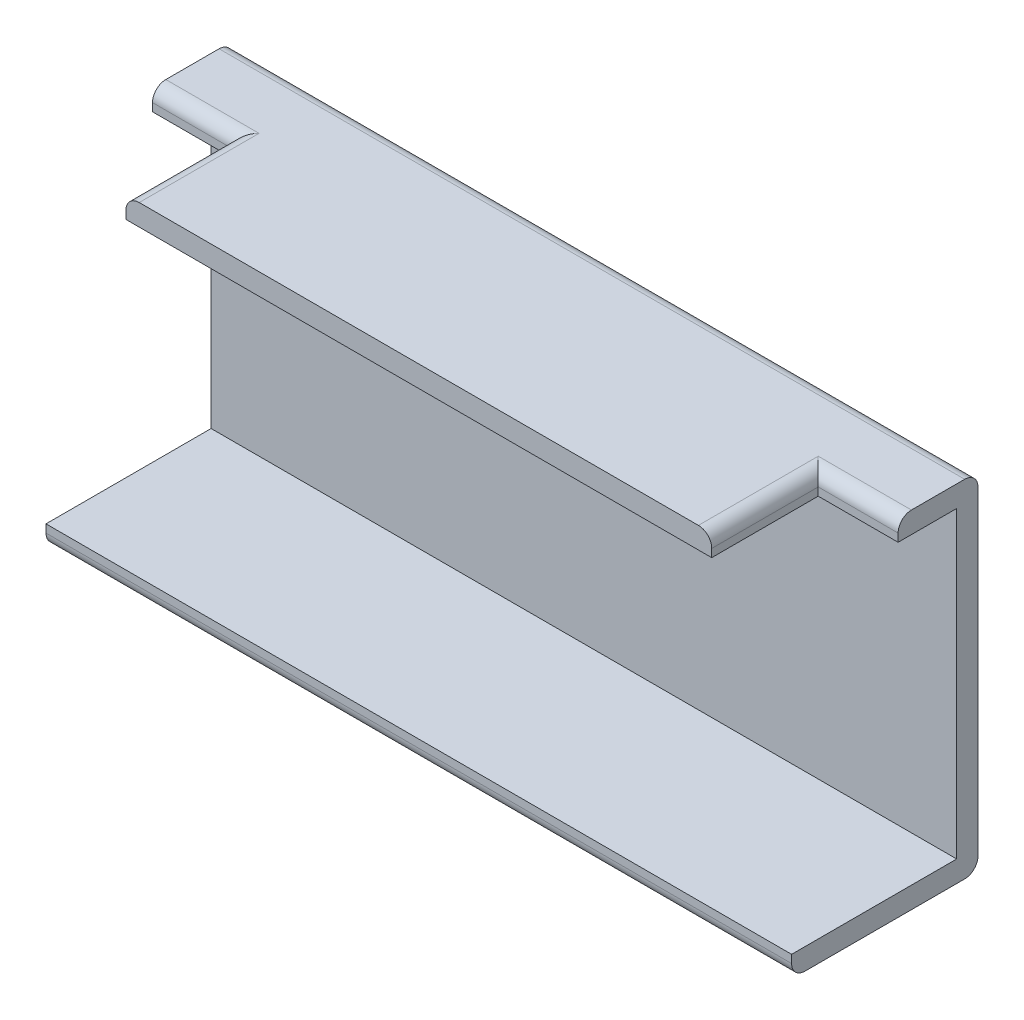
ISO-10303-21;
HEADER;
FILE_DESCRIPTION(('STEP AP214'),'2;1');
FILE_NAME('part.step','',(''),(''),'','','');
FILE_SCHEMA(('AUTOMOTIVE_DESIGN { 1 0 10303 214 1 1 1 1 }'));
ENDSEC;
DATA;
#1=APPLICATION_CONTEXT('core data for automotive mechanical design processes');
#2=APPLICATION_PROTOCOL_DEFINITION('international standard','automotive_design',2000,#1);
#3=PRODUCT_CONTEXT('',#1,'mechanical');
#4=PRODUCT('Part','Part','',(#3));
#5=PRODUCT_RELATED_PRODUCT_CATEGORY('part','',(#4));
#6=PRODUCT_DEFINITION_FORMATION('','',#4);
#7=PRODUCT_DEFINITION_CONTEXT('part definition',#1,'design');
#8=PRODUCT_DEFINITION('design','',#6,#7);
#9=PRODUCT_DEFINITION_SHAPE('','',#8);
#10=(LENGTH_UNIT() NAMED_UNIT(*) SI_UNIT(.MILLI.,.METRE.));
#11=(NAMED_UNIT(*) PLANE_ANGLE_UNIT() SI_UNIT($,.RADIAN.));
#12=(NAMED_UNIT(*) SI_UNIT($,.STERADIAN.) SOLID_ANGLE_UNIT());
#13=UNCERTAINTY_MEASURE_WITH_UNIT(LENGTH_MEASURE(1.E-05),#10,'distance_accuracy_value','');
#14=(GEOMETRIC_REPRESENTATION_CONTEXT(3) GLOBAL_UNCERTAINTY_ASSIGNED_CONTEXT((#13)) GLOBAL_UNIT_ASSIGNED_CONTEXT((#10,
#11,#12)) REPRESENTATION_CONTEXT('',''));
#15=CARTESIAN_POINT('',(0.,0.,0.));
#16=DIRECTION('',(0.,0.,1.));
#17=DIRECTION('',(1.,0.,0.));
#18=AXIS2_PLACEMENT_3D('',#15,#16,#17);
#19=CARTESIAN_POINT('',(-7.304,3.6256,0.423999999999973));
#20=DIRECTION('',(0.,-1.,0.));
#21=DIRECTION('',(1.,0.,0.));
#22=AXIS2_PLACEMENT_3D('',#19,#20,#21);
#23=PLANE('',#22);
#24=DIRECTION('',(1.,0.,0.));
#25=VECTOR('',#24,1.);
#26=CARTESIAN_POINT('',(-7.304,3.6256,0.773999999999972));
#27=LINE('',#26,#25);
#28=CARTESIAN_POINT('',(-7.129,3.6256,0.773999999999972));
#29=VERTEX_POINT('',#28);
#30=CARTESIAN_POINT('',(-6.079,3.6256,0.773999999999972));
#31=VERTEX_POINT('',#30);
#32=EDGE_CURVE('E11',#29,#31,#27,.T.);
#33=ORIENTED_EDGE('',*,*,#32,.T.);
#34=DIRECTION('',(0.,0.,-1.));
#35=VECTOR('',#34,1.);
#36=CARTESIAN_POINT('',(-6.079,3.6256,0.423999999999973));
#37=LINE('',#36,#35);
#38=CARTESIAN_POINT('',(-6.079,3.6256,0.548999999999973));
#39=VERTEX_POINT('',#38);
#40=EDGE_CURVE('E24',#31,#39,#37,.T.);
#41=ORIENTED_EDGE('',*,*,#40,.T.);
#42=DIRECTION('',(1.,0.,0.));
#43=VECTOR('',#42,1.);
#44=CARTESIAN_POINT('',(-7.304,3.6256,0.548999999999973));
#45=LINE('',#44,#43);
#46=CARTESIAN_POINT('',(-5.904,3.6256,0.548999999999972));
#47=VERTEX_POINT('',#46);
#48=EDGE_CURVE('E295',#39,#47,#45,.T.);
#49=ORIENTED_EDGE('',*,*,#48,.T.);
#50=DIRECTION('',(0.,0.,-1.));
#51=VECTOR('',#50,1.);
#52=CARTESIAN_POINT('',(-5.904,3.6256,0.423999999999973));
#53=LINE('',#52,#51);
#54=CARTESIAN_POINT('',(-5.904,3.6256,0.448999999999973));
#55=VERTEX_POINT('',#54);
#56=EDGE_CURVE('E293',#47,#55,#53,.T.);
#57=ORIENTED_EDGE('',*,*,#56,.T.);
#58=DIRECTION('',(-1.,0.,0.));
#59=VECTOR('',#58,1.);
#60=CARTESIAN_POINT('',(-7.304,3.6256,0.448999999999973));
#61=LINE('',#60,#59);
#62=CARTESIAN_POINT('',(-7.304,3.6256,0.448999999999973));
#63=VERTEX_POINT('',#62);
#64=EDGE_CURVE('E291',#55,#63,#61,.T.);
#65=ORIENTED_EDGE('',*,*,#64,.T.);
#66=DIRECTION('',(0.,0.,-1.));
#67=VECTOR('',#66,1.);
#68=CARTESIAN_POINT('',(-7.304,3.6256,0.423999999999973));
#69=LINE('',#68,#67);
#70=CARTESIAN_POINT('',(-7.304,3.6256,0.548999999999972));
#71=VERTEX_POINT('',#70);
#72=EDGE_CURVE('E288',#71,#63,#69,.T.);
#73=ORIENTED_EDGE('',*,*,#72,.F.);
#74=DIRECTION('',(1.,0.,0.));
#75=VECTOR('',#74,1.);
#76=CARTESIAN_POINT('',(-7.304,3.6256,0.548999999999972));
#77=LINE('',#76,#75);
#78=CARTESIAN_POINT('',(-7.129,3.6256,0.548999999999973));
#79=VERTEX_POINT('',#78);
#80=EDGE_CURVE('E286',#71,#79,#77,.T.);
#81=ORIENTED_EDGE('',*,*,#80,.T.);
#82=DIRECTION('',(0.,0.,1.));
#83=VECTOR('',#82,1.);
#84=CARTESIAN_POINT('',(-7.129,3.6256,0.423999999999973));
#85=LINE('',#84,#83);
#86=EDGE_CURVE('E171',#79,#29,#85,.T.);
#87=ORIENTED_EDGE('',*,*,#86,.T.);
#88=EDGE_LOOP('',(#33,#41,#49,#57,#65,#73,#81,#87));
#89=FACE_BOUND('',#88,.T.);
#90=ADVANCED_FACE('F17',(#89),#23,.F.);
#91=CARTESIAN_POINT('',(-7.304,2.9756,0.423999999999972));
#92=DIRECTION('',(0.,0.,1.));
#93=DIRECTION('',(1.,0.,0.));
#94=AXIS2_PLACEMENT_3D('',#91,#92,#93);
#95=PLANE('',#94);
#96=DIRECTION('',(0.,-1.,0.));
#97=VECTOR('',#96,1.);
#98=CARTESIAN_POINT('',(-7.304,2.9756,0.423999999999972));
#99=LINE('',#98,#97);
#100=CARTESIAN_POINT('',(-7.304,3.6006,0.423999999999973));
#101=VERTEX_POINT('',#100);
#102=CARTESIAN_POINT('',(-7.304,3.0006,0.423999999999972));
#103=VERTEX_POINT('',#102);
#104=EDGE_CURVE('E283',#101,#103,#99,.T.);
#105=ORIENTED_EDGE('',*,*,#104,.F.);
#106=DIRECTION('',(1.,0.,0.));
#107=VECTOR('',#106,1.);
#108=CARTESIAN_POINT('',(-7.304,3.6006,0.423999999999973));
#109=LINE('',#108,#107);
#110=CARTESIAN_POINT('',(-5.904,3.6006,0.423999999999973));
#111=VERTEX_POINT('',#110);
#112=EDGE_CURVE('E281',#101,#111,#109,.T.);
#113=ORIENTED_EDGE('',*,*,#112,.T.);
#114=DIRECTION('',(0.,-1.,0.));
#115=VECTOR('',#114,1.);
#116=CARTESIAN_POINT('',(-5.904,2.9756,0.423999999999972));
#117=LINE('',#116,#115);
#118=CARTESIAN_POINT('',(-5.904,3.0006,0.423999999999972));
#119=VERTEX_POINT('',#118);
#120=EDGE_CURVE('E279',#111,#119,#117,.T.);
#121=ORIENTED_EDGE('',*,*,#120,.T.);
#122=DIRECTION('',(-1.,0.,0.));
#123=VECTOR('',#122,1.);
#124=CARTESIAN_POINT('',(-7.304,3.0006,0.423999999999972));
#125=LINE('',#124,#123);
#126=EDGE_CURVE('E276',#119,#103,#125,.T.);
#127=ORIENTED_EDGE('',*,*,#126,.T.);
#128=EDGE_LOOP('',(#105,#113,#121,#127));
#129=FACE_BOUND('',#128,.T.);
#130=ADVANCED_FACE('F358',(#129),#95,.F.);
#131=CARTESIAN_POINT('',(-7.304,2.9756,0.773999999999972));
#132=DIRECTION('',(0.,1.,0.));
#133=DIRECTION('',(0.,0.,-1.));
#134=AXIS2_PLACEMENT_3D('',#131,#132,#133);
#135=PLANE('',#134);
#136=DIRECTION('',(0.,0.,1.));
#137=VECTOR('',#136,1.);
#138=CARTESIAN_POINT('',(-5.904,2.9756,0.773999999999972));
#139=LINE('',#138,#137);
#140=CARTESIAN_POINT('',(-5.904,2.9756,0.448999999999972));
#141=VERTEX_POINT('',#140);
#142=CARTESIAN_POINT('',(-5.904,2.9756,0.748999999999972));
#143=VERTEX_POINT('',#142);
#144=EDGE_CURVE('E274',#141,#143,#139,.T.);
#145=ORIENTED_EDGE('',*,*,#144,.T.);
#146=DIRECTION('',(-1.,0.,0.));
#147=VECTOR('',#146,1.);
#148=CARTESIAN_POINT('',(-7.304,2.9756,0.748999999999972));
#149=LINE('',#148,#147);
#150=CARTESIAN_POINT('',(-7.304,2.9756,0.748999999999972));
#151=VERTEX_POINT('',#150);
#152=EDGE_CURVE('E272',#143,#151,#149,.T.);
#153=ORIENTED_EDGE('',*,*,#152,.T.);
#154=DIRECTION('',(0.,0.,1.));
#155=VECTOR('',#154,1.);
#156=CARTESIAN_POINT('',(-7.304,2.9756,0.773999999999972));
#157=LINE('',#156,#155);
#158=CARTESIAN_POINT('',(-7.304,2.9756,0.448999999999972));
#159=VERTEX_POINT('',#158);
#160=EDGE_CURVE('E269',#159,#151,#157,.T.);
#161=ORIENTED_EDGE('',*,*,#160,.F.);
#162=DIRECTION('',(1.,0.,0.));
#163=VECTOR('',#162,1.);
#164=CARTESIAN_POINT('',(-7.304,2.9756,0.448999999999972));
#165=LINE('',#164,#163);
#166=EDGE_CURVE('E266',#159,#141,#165,.T.);
#167=ORIENTED_EDGE('',*,*,#166,.T.);
#168=EDGE_LOOP('',(#145,#153,#161,#167));
#169=FACE_BOUND('',#168,.T.);
#170=ADVANCED_FACE('F350',(#169),#135,.F.);
#171=CARTESIAN_POINT('',(-7.304,3.0156,0.773999999999972));
#172=DIRECTION('',(0.,0.,-1.));
#173=DIRECTION('',(-1.,0.,0.));
#174=AXIS2_PLACEMENT_3D('',#171,#172,#173);
#175=PLANE('',#174);
#176=DIRECTION('',(0.,1.,0.));
#177=VECTOR('',#176,1.);
#178=CARTESIAN_POINT('',(-7.304,3.0156,0.773999999999972));
#179=LINE('',#178,#177);
#180=CARTESIAN_POINT('',(-7.304,3.0006,0.773999999999972));
#181=VERTEX_POINT('',#180);
#182=CARTESIAN_POINT('',(-7.304,3.0156,0.773999999999972));
#183=VERTEX_POINT('',#182);
#184=EDGE_CURVE('E264',#181,#183,#179,.T.);
#185=ORIENTED_EDGE('',*,*,#184,.F.);
#186=DIRECTION('',(1.,0.,0.));
#187=VECTOR('',#186,1.);
#188=CARTESIAN_POINT('',(-7.304,3.0006,0.773999999999972));
#189=LINE('',#188,#187);
#190=CARTESIAN_POINT('',(-5.904,3.0006,0.773999999999972));
#191=VERTEX_POINT('',#190);
#192=EDGE_CURVE('E262',#181,#191,#189,.T.);
#193=ORIENTED_EDGE('',*,*,#192,.T.);
#194=DIRECTION('',(0.,1.,0.));
#195=VECTOR('',#194,1.);
#196=CARTESIAN_POINT('',(-5.904,3.0156,0.773999999999972));
#197=LINE('',#196,#195);
#198=CARTESIAN_POINT('',(-5.904,3.0156,0.773999999999972));
#199=VERTEX_POINT('',#198);
#200=EDGE_CURVE('E260',#191,#199,#197,.T.);
#201=ORIENTED_EDGE('',*,*,#200,.T.);
#202=DIRECTION('',(1.,0.,0.));
#203=VECTOR('',#202,1.);
#204=CARTESIAN_POINT('',(-7.304,3.0156,0.773999999999972));
#205=LINE('',#204,#203);
#206=EDGE_CURVE('E257',#183,#199,#205,.T.);
#207=ORIENTED_EDGE('',*,*,#206,.F.);
#208=EDGE_LOOP('',(#185,#193,#201,#207));
#209=FACE_BOUND('',#208,.T.);
#210=ADVANCED_FACE('F365',(#209),#175,.F.);
#211=CARTESIAN_POINT('',(-7.304,3.0156,0.463999999999973));
#212=DIRECTION('',(0.,-1.,0.));
#213=DIRECTION('',(0.,0.,1.));
#214=AXIS2_PLACEMENT_3D('',#211,#212,#213);
#215=PLANE('',#214);
#216=DIRECTION('',(0.,0.,-1.));
#217=VECTOR('',#216,1.);
#218=CARTESIAN_POINT('',(-5.904,3.0156,0.463999999999972));
#219=LINE('',#218,#217);
#220=CARTESIAN_POINT('',(-5.904,3.0156,0.463999999999972));
#221=VERTEX_POINT('',#220);
#222=EDGE_CURVE('E255',#199,#221,#219,.T.);
#223=ORIENTED_EDGE('',*,*,#222,.T.);
#224=DIRECTION('',(1.,0.,0.));
#225=VECTOR('',#224,1.);
#226=CARTESIAN_POINT('',(-7.304,3.0156,0.463999999999972));
#227=LINE('',#226,#225);
#228=CARTESIAN_POINT('',(-7.304,3.0156,0.463999999999972));
#229=VERTEX_POINT('',#228);
#230=EDGE_CURVE('E252',#229,#221,#227,.T.);
#231=ORIENTED_EDGE('',*,*,#230,.F.);
#232=DIRECTION('',(0.,0.,-1.));
#233=VECTOR('',#232,1.);
#234=CARTESIAN_POINT('',(-7.304,3.0156,0.463999999999972));
#235=LINE('',#234,#233);
#236=EDGE_CURVE('E249',#183,#229,#235,.T.);
#237=ORIENTED_EDGE('',*,*,#236,.F.);
#238=ORIENTED_EDGE('',*,*,#206,.T.);
#239=EDGE_LOOP('',(#223,#231,#237,#238));
#240=FACE_BOUND('',#239,.T.);
#241=ADVANCED_FACE('F340',(#240),#215,.F.);
#242=CARTESIAN_POINT('',(-7.304,3.5856,0.463999999999973));
#243=DIRECTION('',(0.,0.,-1.));
#244=DIRECTION('',(-1.,0.,0.));
#245=AXIS2_PLACEMENT_3D('',#242,#243,#244);
#246=PLANE('',#245);
#247=DIRECTION('',(0.,1.,0.));
#248=VECTOR('',#247,1.);
#249=CARTESIAN_POINT('',(-5.904,3.5856,0.463999999999973));
#250=LINE('',#249,#248);
#251=CARTESIAN_POINT('',(-5.904,3.5856,0.463999999999973));
#252=VERTEX_POINT('',#251);
#253=EDGE_CURVE('E247',#221,#252,#250,.T.);
#254=ORIENTED_EDGE('',*,*,#253,.T.);
#255=DIRECTION('',(1.,0.,0.));
#256=VECTOR('',#255,1.);
#257=CARTESIAN_POINT('',(-7.304,3.5856,0.463999999999973));
#258=LINE('',#257,#256);
#259=CARTESIAN_POINT('',(-7.304,3.5856,0.463999999999973));
#260=VERTEX_POINT('',#259);
#261=EDGE_CURVE('E244',#260,#252,#258,.T.);
#262=ORIENTED_EDGE('',*,*,#261,.F.);
#263=DIRECTION('',(0.,1.,0.));
#264=VECTOR('',#263,1.);
#265=CARTESIAN_POINT('',(-7.304,3.5856,0.463999999999973));
#266=LINE('',#265,#264);
#267=EDGE_CURVE('E241',#229,#260,#266,.T.);
#268=ORIENTED_EDGE('',*,*,#267,.F.);
#269=ORIENTED_EDGE('',*,*,#230,.T.);
#270=EDGE_LOOP('',(#254,#262,#268,#269));
#271=FACE_BOUND('',#270,.T.);
#272=ADVANCED_FACE('F336',(#271),#246,.F.);
#273=CARTESIAN_POINT('',(-7.304,3.5856,0.773999999999972));
#274=DIRECTION('',(0.,1.,0.));
#275=DIRECTION('',(0.,0.,-1.));
#276=AXIS2_PLACEMENT_3D('',#273,#274,#275);
#277=PLANE('',#276);
#278=DIRECTION('',(0.,0.,1.));
#279=VECTOR('',#278,1.);
#280=CARTESIAN_POINT('',(-5.904,3.5856,0.773999999999972));
#281=LINE('',#280,#279);
#282=CARTESIAN_POINT('',(-5.904,3.5856,0.573999999999972));
#283=VERTEX_POINT('',#282);
#284=EDGE_CURVE('E239',#252,#283,#281,.T.);
#285=ORIENTED_EDGE('',*,*,#284,.T.);
#286=DIRECTION('',(-1.,0.,0.));
#287=VECTOR('',#286,1.);
#288=CARTESIAN_POINT('',(-5.904,3.5856,0.573999999999972));
#289=LINE('',#288,#287);
#290=CARTESIAN_POINT('',(-6.054,3.5856,0.573999999999972));
#291=VERTEX_POINT('',#290);
#292=EDGE_CURVE('E237',#283,#291,#289,.T.);
#293=ORIENTED_EDGE('',*,*,#292,.T.);
#294=DIRECTION('',(0.,0.,1.));
#295=VECTOR('',#294,1.);
#296=CARTESIAN_POINT('',(-6.054,3.5856,0.573999999999972));
#297=LINE('',#296,#295);
#298=CARTESIAN_POINT('',(-6.054,3.5856,0.773999999999972));
#299=VERTEX_POINT('',#298);
#300=EDGE_CURVE('E235',#291,#299,#297,.T.);
#301=ORIENTED_EDGE('',*,*,#300,.T.);
#302=DIRECTION('',(1.,0.,0.));
#303=VECTOR('',#302,1.);
#304=CARTESIAN_POINT('',(-7.304,3.5856,0.773999999999972));
#305=LINE('',#304,#303);
#306=CARTESIAN_POINT('',(-7.154,3.5856,0.773999999999972));
#307=VERTEX_POINT('',#306);
#308=EDGE_CURVE('E232',#307,#299,#305,.T.);
#309=ORIENTED_EDGE('',*,*,#308,.F.);
#310=DIRECTION('',(0.,0.,-1.));
#311=VECTOR('',#310,1.);
#312=CARTESIAN_POINT('',(-7.154,3.5856,0.573999999999972));
#313=LINE('',#312,#311);
#314=CARTESIAN_POINT('',(-7.154,3.5856,0.573999999999972));
#315=VERTEX_POINT('',#314);
#316=EDGE_CURVE('E230',#307,#315,#313,.T.);
#317=ORIENTED_EDGE('',*,*,#316,.T.);
#318=DIRECTION('',(-1.,0.,0.));
#319=VECTOR('',#318,1.);
#320=CARTESIAN_POINT('',(-7.304,3.5856,0.573999999999972));
#321=LINE('',#320,#319);
#322=CARTESIAN_POINT('',(-7.304,3.5856,0.573999999999972));
#323=VERTEX_POINT('',#322);
#324=EDGE_CURVE('E157',#315,#323,#321,.T.);
#325=ORIENTED_EDGE('',*,*,#324,.T.);
#326=DIRECTION('',(0.,0.,1.));
#327=VECTOR('',#326,1.);
#328=CARTESIAN_POINT('',(-7.304,3.5856,0.773999999999972));
#329=LINE('',#328,#327);
#330=EDGE_CURVE('E226',#260,#323,#329,.T.);
#331=ORIENTED_EDGE('',*,*,#330,.F.);
#332=ORIENTED_EDGE('',*,*,#261,.T.);
#333=EDGE_LOOP('',(#285,#293,#301,#309,#317,#325,#331,#332));
#334=FACE_BOUND('',#333,.T.);
#335=ADVANCED_FACE('F332',(#334),#277,.F.);
#336=CARTESIAN_POINT('',(-7.304,3.6256,0.773999999999972));
#337=DIRECTION('',(0.,0.,-1.));
#338=DIRECTION('',(-1.,0.,0.));
#339=AXIS2_PLACEMENT_3D('',#336,#337,#338);
#340=PLANE('',#339);
#341=DIRECTION('',(0.,1.,0.));
#342=VECTOR('',#341,1.);
#343=CARTESIAN_POINT('',(-6.054,3.6256,0.773999999999972));
#344=LINE('',#343,#342);
#345=CARTESIAN_POINT('',(-6.054,3.6006,0.773999999999972));
#346=VERTEX_POINT('',#345);
#347=EDGE_CURVE('E224',#299,#346,#344,.T.);
#348=ORIENTED_EDGE('',*,*,#347,.T.);
#349=CARTESIAN_POINT('',(-6.079,3.6006,0.773999999999972));
#350=DIRECTION('',(0.,0.,1.));
#351=DIRECTION('',(-1.,0.,0.));
#352=AXIS2_PLACEMENT_3D('',#349,#350,#351);
#353=CIRCLE('',#352,0.0249999999999998);
#354=EDGE_CURVE('E222',#346,#31,#353,.T.);
#355=ORIENTED_EDGE('',*,*,#354,.T.);
#356=ORIENTED_EDGE('',*,*,#32,.F.);
#357=CARTESIAN_POINT('',(-7.129,3.6006,0.773999999999972));
#358=DIRECTION('',(0.,0.,1.));
#359=DIRECTION('',(-1.,0.,0.));
#360=AXIS2_PLACEMENT_3D('',#357,#358,#359);
#361=CIRCLE('',#360,0.0249999999999998);
#362=CARTESIAN_POINT('',(-7.154,3.6006,0.773999999999972));
#363=VERTEX_POINT('',#362);
#364=EDGE_CURVE('E220',#29,#363,#361,.T.);
#365=ORIENTED_EDGE('',*,*,#364,.T.);
#366=DIRECTION('',(0.,-1.,0.));
#367=VECTOR('',#366,1.);
#368=CARTESIAN_POINT('',(-7.154,3.6256,0.773999999999972));
#369=LINE('',#368,#367);
#370=EDGE_CURVE('E144',#363,#307,#369,.T.);
#371=ORIENTED_EDGE('',*,*,#370,.T.);
#372=ORIENTED_EDGE('',*,*,#308,.T.);
#373=EDGE_LOOP('',(#348,#355,#356,#365,#371,#372));
#374=FACE_BOUND('',#373,.T.);
#375=ADVANCED_FACE('F328',(#374),#340,.F.);
#376=CARTESIAN_POINT('',(-7.304,2.9756,1.524));
#377=DIRECTION('',(1.,0.,0.));
#378=DIRECTION('',(0.,0.,-1.));
#379=AXIS2_PLACEMENT_3D('',#376,#377,#378);
#380=PLANE('',#379);
#381=ORIENTED_EDGE('',*,*,#160,.T.);
#382=CARTESIAN_POINT('',(-7.304,3.0006,0.748999999999972));
#383=DIRECTION('',(-1.,0.,0.));
#384=DIRECTION('',(0.,0.,-1.));
#385=AXIS2_PLACEMENT_3D('',#382,#383,#384);
#386=CIRCLE('',#385,0.025);
#387=EDGE_CURVE('E216',#151,#181,#386,.T.);
#388=ORIENTED_EDGE('',*,*,#387,.T.);
#389=ORIENTED_EDGE('',*,*,#184,.T.);
#390=ORIENTED_EDGE('',*,*,#236,.T.);
#391=ORIENTED_EDGE('',*,*,#267,.T.);
#392=ORIENTED_EDGE('',*,*,#330,.T.);
#393=DIRECTION('',(0.,1.,0.));
#394=VECTOR('',#393,1.);
#395=CARTESIAN_POINT('',(-7.304,3.5856,0.573999999999972));
#396=LINE('',#395,#394);
#397=CARTESIAN_POINT('',(-7.304,3.6006,0.573999999999972));
#398=VERTEX_POINT('',#397);
#399=EDGE_CURVE('E214',#323,#398,#396,.T.);
#400=ORIENTED_EDGE('',*,*,#399,.T.);
#401=CARTESIAN_POINT('',(-7.304,3.6006,0.548999999999972));
#402=DIRECTION('',(-1.,0.,0.));
#403=DIRECTION('',(0.,0.,-1.));
#404=AXIS2_PLACEMENT_3D('',#401,#402,#403);
#405=CIRCLE('',#404,0.025);
#406=EDGE_CURVE('E166',#398,#71,#405,.T.);
#407=ORIENTED_EDGE('',*,*,#406,.T.);
#408=ORIENTED_EDGE('',*,*,#72,.T.);
#409=CARTESIAN_POINT('',(-7.304,3.6006,0.448999999999973));
#410=DIRECTION('',(-1.,0.,0.));
#411=DIRECTION('',(0.,0.,-1.));
#412=AXIS2_PLACEMENT_3D('',#409,#410,#411);
#413=CIRCLE('',#412,0.025);
#414=EDGE_CURVE('E210',#63,#101,#413,.T.);
#415=ORIENTED_EDGE('',*,*,#414,.T.);
#416=ORIENTED_EDGE('',*,*,#104,.T.);
#417=CARTESIAN_POINT('',(-7.304,3.0006,0.448999999999972));
#418=DIRECTION('',(-1.,0.,0.));
#419=DIRECTION('',(0.,0.,-1.));
#420=AXIS2_PLACEMENT_3D('',#417,#418,#419);
#421=CIRCLE('',#420,0.025);
#422=EDGE_CURVE('E207',#103,#159,#421,.T.);
#423=ORIENTED_EDGE('',*,*,#422,.T.);
#424=EDGE_LOOP('',(#381,#388,#389,#390,#391,#392,#400,#407,#408,#415,#416,#423));
#425=FACE_BOUND('',#424,.T.);
#426=ADVANCED_FACE('F327',(#425),#380,.F.);
#427=CARTESIAN_POINT('',(-5.904,2.9756,1.524));
#428=DIRECTION('',(1.,0.,0.));
#429=DIRECTION('',(0.,0.,-1.));
#430=AXIS2_PLACEMENT_3D('',#427,#428,#429);
#431=PLANE('',#430);
#432=ORIENTED_EDGE('',*,*,#200,.F.);
#433=CARTESIAN_POINT('',(-5.904,3.0006,0.748999999999972));
#434=DIRECTION('',(1.,0.,0.));
#435=DIRECTION('',(0.,0.,-1.));
#436=AXIS2_PLACEMENT_3D('',#433,#434,#435);
#437=CIRCLE('',#436,0.025);
#438=EDGE_CURVE('E204',#191,#143,#437,.T.);
#439=ORIENTED_EDGE('',*,*,#438,.T.);
#440=ORIENTED_EDGE('',*,*,#144,.F.);
#441=CARTESIAN_POINT('',(-5.904,3.0006,0.448999999999972));
#442=DIRECTION('',(1.,0.,0.));
#443=DIRECTION('',(0.,0.,-1.));
#444=AXIS2_PLACEMENT_3D('',#441,#442,#443);
#445=CIRCLE('',#444,0.025);
#446=EDGE_CURVE('E201',#141,#119,#445,.T.);
#447=ORIENTED_EDGE('',*,*,#446,.T.);
#448=ORIENTED_EDGE('',*,*,#120,.F.);
#449=CARTESIAN_POINT('',(-5.904,3.6006,0.448999999999973));
#450=DIRECTION('',(1.,0.,0.));
#451=DIRECTION('',(0.,0.,-1.));
#452=AXIS2_PLACEMENT_3D('',#449,#450,#451);
#453=CIRCLE('',#452,0.025);
#454=EDGE_CURVE('E198',#111,#55,#453,.T.);
#455=ORIENTED_EDGE('',*,*,#454,.T.);
#456=ORIENTED_EDGE('',*,*,#56,.F.);
#457=CARTESIAN_POINT('',(-5.904,3.6006,0.548999999999972));
#458=DIRECTION('',(1.,0.,0.));
#459=DIRECTION('',(0.,0.,-1.));
#460=AXIS2_PLACEMENT_3D('',#457,#458,#459);
#461=CIRCLE('',#460,0.025);
#462=CARTESIAN_POINT('',(-5.904,3.6006,0.573999999999972));
#463=VERTEX_POINT('',#462);
#464=EDGE_CURVE('E196',#47,#463,#461,.T.);
#465=ORIENTED_EDGE('',*,*,#464,.T.);
#466=DIRECTION('',(0.,1.,0.));
#467=VECTOR('',#466,1.);
#468=CARTESIAN_POINT('',(-5.904,3.5856,0.573999999999972));
#469=LINE('',#468,#467);
#470=EDGE_CURVE('E193',#283,#463,#469,.T.);
#471=ORIENTED_EDGE('',*,*,#470,.F.);
#472=ORIENTED_EDGE('',*,*,#284,.F.);
#473=ORIENTED_EDGE('',*,*,#253,.F.);
#474=ORIENTED_EDGE('',*,*,#222,.F.);
#475=EDGE_LOOP('',(#432,#439,#440,#447,#448,#455,#456,#465,#471,#472,#473,#474));
#476=FACE_BOUND('',#475,.T.);
#477=ADVANCED_FACE('F317',(#476),#431,.T.);
#478=CARTESIAN_POINT('',(-6.054,3.5856,0.573999999999972));
#479=DIRECTION('',(-1.,0.,0.));
#480=DIRECTION('',(0.,0.,1.));
#481=AXIS2_PLACEMENT_3D('',#478,#479,#480);
#482=PLANE('',#481);
#483=DIRECTION('',(0.,1.,0.));
#484=VECTOR('',#483,1.);
#485=CARTESIAN_POINT('',(-6.054,3.5856,0.573999999999972));
#486=LINE('',#485,#484);
#487=CARTESIAN_POINT('',(-6.054,3.6006,0.573999999999972));
#488=VERTEX_POINT('',#487);
#489=EDGE_CURVE('E191',#291,#488,#486,.T.);
#490=ORIENTED_EDGE('',*,*,#489,.T.);
#491=DIRECTION('',(0.,0.,1.));
#492=VECTOR('',#491,1.);
#493=CARTESIAN_POINT('',(-6.054,3.6006,0.573999999999972));
#494=LINE('',#493,#492);
#495=EDGE_CURVE('E188',#488,#346,#494,.T.);
#496=ORIENTED_EDGE('',*,*,#495,.T.);
#497=ORIENTED_EDGE('',*,*,#347,.F.);
#498=ORIENTED_EDGE('',*,*,#300,.F.);
#499=EDGE_LOOP('',(#490,#496,#497,#498));
#500=FACE_BOUND('',#499,.T.);
#501=ADVANCED_FACE('F331',(#500),#482,.F.);
#502=CARTESIAN_POINT('',(-5.904,3.5856,0.573999999999972));
#503=DIRECTION('',(0.,0.,-1.));
#504=DIRECTION('',(-1.,0.,0.));
#505=AXIS2_PLACEMENT_3D('',#502,#503,#504);
#506=PLANE('',#505);
#507=ORIENTED_EDGE('',*,*,#470,.T.);
#508=DIRECTION('',(-1.,0.,0.));
#509=VECTOR('',#508,1.);
#510=CARTESIAN_POINT('',(-5.904,3.6006,0.573999999999972));
#511=LINE('',#510,#509);
#512=EDGE_CURVE('E148',#463,#488,#511,.T.);
#513=ORIENTED_EDGE('',*,*,#512,.T.);
#514=ORIENTED_EDGE('',*,*,#489,.F.);
#515=ORIENTED_EDGE('',*,*,#292,.F.);
#516=EDGE_LOOP('',(#507,#513,#514,#515));
#517=FACE_BOUND('',#516,.T.);
#518=ADVANCED_FACE('F311',(#517),#506,.F.);
#519=CARTESIAN_POINT('',(-7.154,3.5856,0.573999999999972));
#520=DIRECTION('',(1.,0.,0.));
#521=DIRECTION('',(0.,0.,-1.));
#522=AXIS2_PLACEMENT_3D('',#519,#520,#521);
#523=PLANE('',#522);
#524=ORIENTED_EDGE('',*,*,#370,.F.);
#525=DIRECTION('',(0.,0.,-1.));
#526=VECTOR('',#525,1.);
#527=CARTESIAN_POINT('',(-7.154,3.6006,0.573999999999972));
#528=LINE('',#527,#526);
#529=CARTESIAN_POINT('',(-7.154,3.6006,0.573999999999972));
#530=VERTEX_POINT('',#529);
#531=EDGE_CURVE('E138',#363,#530,#528,.T.);
#532=ORIENTED_EDGE('',*,*,#531,.T.);
#533=DIRECTION('',(0.,1.,0.));
#534=VECTOR('',#533,1.);
#535=CARTESIAN_POINT('',(-7.154,3.5856,0.573999999999972));
#536=LINE('',#535,#534);
#537=EDGE_CURVE('E142',#315,#530,#536,.T.);
#538=ORIENTED_EDGE('',*,*,#537,.F.);
#539=ORIENTED_EDGE('',*,*,#316,.F.);
#540=EDGE_LOOP('',(#524,#532,#538,#539));
#541=FACE_BOUND('',#540,.T.);
#542=ADVANCED_FACE('F140',(#541),#523,.F.);
#543=CARTESIAN_POINT('',(-7.304,3.5856,0.573999999999972));
#544=DIRECTION('',(0.,0.,-1.));
#545=DIRECTION('',(-1.,0.,0.));
#546=AXIS2_PLACEMENT_3D('',#543,#544,#545);
#547=PLANE('',#546);
#548=ORIENTED_EDGE('',*,*,#537,.T.);
#549=DIRECTION('',(-1.,0.,0.));
#550=VECTOR('',#549,1.);
#551=CARTESIAN_POINT('',(-7.304,3.6006,0.573999999999972));
#552=LINE('',#551,#550);
#553=EDGE_CURVE('E156',#530,#398,#552,.T.);
#554=ORIENTED_EDGE('',*,*,#553,.T.);
#555=ORIENTED_EDGE('',*,*,#399,.F.);
#556=ORIENTED_EDGE('',*,*,#324,.F.);
#557=EDGE_LOOP('',(#548,#554,#555,#556));
#558=FACE_BOUND('',#557,.T.);
#559=ADVANCED_FACE('F154',(#558),#547,.F.);
#560=CARTESIAN_POINT('',(-7.304,3.0006,0.748999999999972));
#561=DIRECTION('',(1.,0.,0.));
#562=DIRECTION('',(0.,0.,-1.));
#563=AXIS2_PLACEMENT_3D('',#560,#561,#562);
#564=CYLINDRICAL_SURFACE('',#563,0.025);
#565=ORIENTED_EDGE('',*,*,#387,.F.);
#566=ORIENTED_EDGE('',*,*,#152,.F.);
#567=ORIENTED_EDGE('',*,*,#438,.F.);
#568=ORIENTED_EDGE('',*,*,#192,.F.);
#569=EDGE_LOOP('',(#565,#566,#567,#568));
#570=FACE_BOUND('',#569,.T.);
#571=ADVANCED_FACE('F348',(#570),#564,.T.);
#572=CARTESIAN_POINT('',(-5.904,3.6006,0.548999999999972));
#573=DIRECTION('',(-1.,0.,0.));
#574=DIRECTION('',(0.,0.,1.));
#575=AXIS2_PLACEMENT_3D('',#572,#573,#574);
#576=CYLINDRICAL_SURFACE('',#575,0.025);
#577=ORIENTED_EDGE('',*,*,#464,.F.);
#578=ORIENTED_EDGE('',*,*,#48,.F.);
#579=CARTESIAN_POINT('',(-6.054,3.6006,0.573999999999972));
#580=CARTESIAN_POINT('',(-6.05399999999999,3.61524466094072,0.573999999999972));
#581=CARTESIAN_POINT('',(-6.06435533905928,3.6256,0.563644660940645));
#582=CARTESIAN_POINT('',(-6.079,3.6256,0.548999999999973));
#583=(BOUNDED_CURVE() B_SPLINE_CURVE(3,(#579,#580,#581,#582),.UNSPECIFIED.,.F.,
.F.) B_SPLINE_CURVE_WITH_KNOTS((4,4),(0.,1.5707963267949),
.UNSPECIFIED.) CURVE() GEOMETRIC_REPRESENTATION_ITEM() RATIONAL_B_SPLINE_CURVE((1.,
0.804737854124365,0.804737854124365,1.)) REPRESENTATION_ITEM(''));
#584=EDGE_CURVE('E167',#488,#39,#583,.T.);
#585=ORIENTED_EDGE('',*,*,#584,.F.);
#586=ORIENTED_EDGE('',*,*,#512,.F.);
#587=EDGE_LOOP('',(#577,#578,#585,#586));
#588=FACE_BOUND('',#587,.T.);
#589=ADVANCED_FACE('F303',(#588),#576,.T.);
#590=CARTESIAN_POINT('',(-6.079,3.6006,0.573999999999972));
#591=DIRECTION('',(0.,0.,1.));
#592=DIRECTION('',(1.,0.,0.));
#593=AXIS2_PLACEMENT_3D('',#590,#591,#592);
#594=CYLINDRICAL_SURFACE('',#593,0.0249999999999998);
#595=ORIENTED_EDGE('',*,*,#584,.T.);
#596=ORIENTED_EDGE('',*,*,#40,.F.);
#597=ORIENTED_EDGE('',*,*,#354,.F.);
#598=ORIENTED_EDGE('',*,*,#495,.F.);
#599=EDGE_LOOP('',(#595,#596,#597,#598));
#600=FACE_BOUND('',#599,.T.);
#601=ADVANCED_FACE('F306',(#600),#594,.T.);
#602=CARTESIAN_POINT('',(-7.304,3.6006,0.548999999999972));
#603=DIRECTION('',(-1.,0.,0.));
#604=DIRECTION('',(0.,0.,1.));
#605=AXIS2_PLACEMENT_3D('',#602,#603,#604);
#606=CYLINDRICAL_SURFACE('',#605,0.025);
#607=ORIENTED_EDGE('',*,*,#406,.F.);
#608=ORIENTED_EDGE('',*,*,#553,.F.);
#609=CARTESIAN_POINT('',(-7.129,3.6256,0.548999999999973));
#610=CARTESIAN_POINT('',(-7.1436446609407,3.6256,0.563644660940645));
#611=CARTESIAN_POINT('',(-7.15399999999999,3.61524466094072,0.573999999999972));
#612=CARTESIAN_POINT('',(-7.154,3.6006,0.573999999999972));
#613=(BOUNDED_CURVE() B_SPLINE_CURVE(3,(#609,#610,#611,#612),.UNSPECIFIED.,.F.,
.F.) B_SPLINE_CURVE_WITH_KNOTS((4,4),(1.5707963267949,3.14159265358979),
.UNSPECIFIED.) CURVE() GEOMETRIC_REPRESENTATION_ITEM() RATIONAL_B_SPLINE_CURVE((1.,
0.804737854124365,0.804737854124365,1.)) REPRESENTATION_ITEM(''));
#614=EDGE_CURVE('E164',#79,#530,#613,.T.);
#615=ORIENTED_EDGE('',*,*,#614,.F.);
#616=ORIENTED_EDGE('',*,*,#80,.F.);
#617=EDGE_LOOP('',(#607,#608,#615,#616));
#618=FACE_BOUND('',#617,.T.);
#619=ADVANCED_FACE('F162',(#618),#606,.T.);
#620=CARTESIAN_POINT('',(-7.129,3.6006,0.573999999999972));
#621=DIRECTION('',(0.,0.,-1.));
#622=DIRECTION('',(-1.,0.,0.));
#623=AXIS2_PLACEMENT_3D('',#620,#621,#622);
#624=CYLINDRICAL_SURFACE('',#623,0.0249999999999998);
#625=ORIENTED_EDGE('',*,*,#364,.F.);
#626=ORIENTED_EDGE('',*,*,#86,.F.);
#627=ORIENTED_EDGE('',*,*,#614,.T.);
#628=ORIENTED_EDGE('',*,*,#531,.F.);
#629=EDGE_LOOP('',(#625,#626,#627,#628));
#630=FACE_BOUND('',#629,.T.);
#631=ADVANCED_FACE('F170',(#630),#624,.T.);
#632=CARTESIAN_POINT('',(-7.304,3.6006,0.448999999999973));
#633=DIRECTION('',(1.,0.,0.));
#634=DIRECTION('',(0.,0.,-1.));
#635=AXIS2_PLACEMENT_3D('',#632,#633,#634);
#636=CYLINDRICAL_SURFACE('',#635,0.025);
#637=ORIENTED_EDGE('',*,*,#414,.F.);
#638=ORIENTED_EDGE('',*,*,#64,.F.);
#639=ORIENTED_EDGE('',*,*,#454,.F.);
#640=ORIENTED_EDGE('',*,*,#112,.F.);
#641=EDGE_LOOP('',(#637,#638,#639,#640));
#642=FACE_BOUND('',#641,.T.);
#643=ADVANCED_FACE('F324',(#642),#636,.T.);
#644=CARTESIAN_POINT('',(-7.304,3.0006,0.448999999999972));
#645=DIRECTION('',(1.,0.,0.));
#646=DIRECTION('',(0.,0.,-1.));
#647=AXIS2_PLACEMENT_3D('',#644,#645,#646);
#648=CYLINDRICAL_SURFACE('',#647,0.025);
#649=ORIENTED_EDGE('',*,*,#422,.F.);
#650=ORIENTED_EDGE('',*,*,#126,.F.);
#651=ORIENTED_EDGE('',*,*,#446,.F.);
#652=ORIENTED_EDGE('',*,*,#166,.F.);
#653=EDGE_LOOP('',(#649,#650,#651,#652));
#654=FACE_BOUND('',#653,.T.);
#655=ADVANCED_FACE('F355',(#654),#648,.T.);
#656=CLOSED_SHELL('',(#90,#130,#170,#210,#241,#272,#335,#375,#426,#477,#501,#518,#542,#559,#571,
#589,#601,#619,#631,#643,#655));
#657=MANIFOLD_SOLID_BREP('B1',#656);
#658=ADVANCED_BREP_SHAPE_REPRESENTATION('',(#18,#657),#14);
#659=SHAPE_DEFINITION_REPRESENTATION(#9,#658);
ENDSEC;
END-ISO-10303-21;
